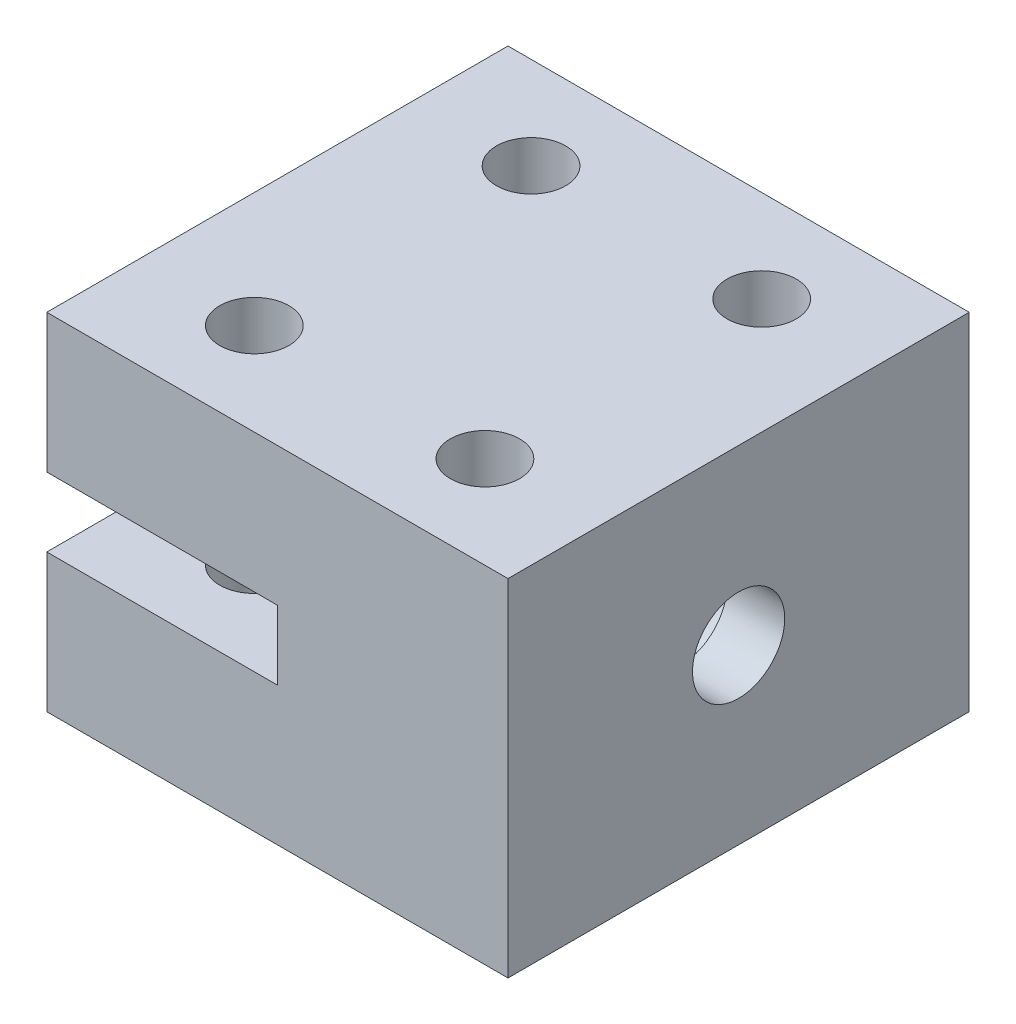
ISO-10303-21;
HEADER;
FILE_DESCRIPTION(('STEP AP214'),'2;1');
FILE_NAME('part.step','',(''),(''),'','','');
FILE_SCHEMA(('AUTOMOTIVE_DESIGN { 1 0 10303 214 1 1 1 1 }'));
ENDSEC;
DATA;
#1=APPLICATION_CONTEXT('core data for automotive mechanical design processes');
#2=APPLICATION_PROTOCOL_DEFINITION('international standard','automotive_design',2000,#1);
#3=PRODUCT_CONTEXT('',#1,'mechanical');
#4=PRODUCT('Part','Part','',(#3));
#5=PRODUCT_RELATED_PRODUCT_CATEGORY('part','',(#4));
#6=PRODUCT_DEFINITION_FORMATION('','',#4);
#7=PRODUCT_DEFINITION_CONTEXT('part definition',#1,'design');
#8=PRODUCT_DEFINITION('design','',#6,#7);
#9=PRODUCT_DEFINITION_SHAPE('','',#8);
#10=(LENGTH_UNIT() NAMED_UNIT(*) SI_UNIT(.MILLI.,.METRE.));
#11=(NAMED_UNIT(*) PLANE_ANGLE_UNIT() SI_UNIT($,.RADIAN.));
#12=(NAMED_UNIT(*) SI_UNIT($,.STERADIAN.) SOLID_ANGLE_UNIT());
#13=UNCERTAINTY_MEASURE_WITH_UNIT(LENGTH_MEASURE(1.E-05),#10,'distance_accuracy_value','');
#14=(GEOMETRIC_REPRESENTATION_CONTEXT(3) GLOBAL_UNCERTAINTY_ASSIGNED_CONTEXT((#13)) GLOBAL_UNIT_ASSIGNED_CONTEXT((#10,
#11,#12)) REPRESENTATION_CONTEXT('',''));
#15=CARTESIAN_POINT('',(0.,0.,0.));
#16=DIRECTION('',(0.,0.,1.));
#17=DIRECTION('',(1.,0.,0.));
#18=AXIS2_PLACEMENT_3D('',#15,#16,#17);
#19=CARTESIAN_POINT('',(9.99999999999999,7.5,-10.));
#20=DIRECTION('',(-1.,0.,0.));
#21=DIRECTION('',(0.,0.,1.));
#22=AXIS2_PLACEMENT_3D('',#19,#20,#21);
#23=PLANE('',#22);
#24=CARTESIAN_POINT('',(9.99999999999999,0.,0.));
#25=DIRECTION('',(1.,0.,0.));
#26=DIRECTION('',(0.,0.,-1.));
#27=AXIS2_PLACEMENT_3D('',#24,#25,#26);
#28=CIRCLE('',#27,2.);
#29=CARTESIAN_POINT('',(9.99999999999999,0.,-2.));
#30=VERTEX_POINT('',#29);
#31=EDGE_CURVE('E194',#30,#30,#28,.T.);
#32=ORIENTED_EDGE('',*,*,#31,.F.);
#33=EDGE_LOOP('',(#32));
#34=FACE_BOUND('',#33,.T.);
#35=DIRECTION('',(0.,-1.,0.));
#36=VECTOR('',#35,1.);
#37=CARTESIAN_POINT('',(9.99999999999999,7.5,-10.));
#38=LINE('',#37,#36);
#39=CARTESIAN_POINT('',(9.99999999999999,7.5,-10.));
#40=VERTEX_POINT('',#39);
#41=CARTESIAN_POINT('',(9.99999999999999,-7.5,-10.));
#42=VERTEX_POINT('',#41);
#43=EDGE_CURVE('E76',#40,#42,#38,.T.);
#44=ORIENTED_EDGE('',*,*,#43,.F.);
#45=DIRECTION('',(0.,0.,-1.));
#46=VECTOR('',#45,1.);
#47=CARTESIAN_POINT('',(9.99999999999999,7.5,-10.));
#48=LINE('',#47,#46);
#49=CARTESIAN_POINT('',(9.99999999999999,7.5,10.));
#50=VERTEX_POINT('',#49);
#51=EDGE_CURVE('E138',#50,#40,#48,.T.);
#52=ORIENTED_EDGE('',*,*,#51,.F.);
#53=DIRECTION('',(0.,-1.,0.));
#54=VECTOR('',#53,1.);
#55=CARTESIAN_POINT('',(9.99999999999999,7.5,10.));
#56=LINE('',#55,#54);
#57=CARTESIAN_POINT('',(9.99999999999999,-7.5,10.));
#58=VERTEX_POINT('',#57);
#59=EDGE_CURVE('E37',#50,#58,#56,.T.);
#60=ORIENTED_EDGE('',*,*,#59,.T.);
#61=DIRECTION('',(0.,0.,-1.));
#62=VECTOR('',#61,1.);
#63=CARTESIAN_POINT('',(9.99999999999999,-7.5,-10.));
#64=LINE('',#63,#62);
#65=EDGE_CURVE('E90',#58,#42,#64,.T.);
#66=ORIENTED_EDGE('',*,*,#65,.T.);
#67=EDGE_LOOP('',(#44,#52,#60,#66));
#68=FACE_BOUND('',#67,.T.);
#69=ADVANCED_FACE('F34',(#34,#68),#23,.F.);
#70=CARTESIAN_POINT('',(-10.,7.5,-10.));
#71=DIRECTION('',(0.,0.,1.));
#72=DIRECTION('',(1.,0.,0.));
#73=AXIS2_PLACEMENT_3D('',#70,#71,#72);
#74=PLANE('',#73);
#75=DIRECTION('',(-1.,0.,0.));
#76=VECTOR('',#75,1.);
#77=CARTESIAN_POINT('',(-10.,-1.5,-10.));
#78=LINE('',#77,#76);
#79=CARTESIAN_POINT('',(0.,-1.5,-10.));
#80=VERTEX_POINT('',#79);
#81=CARTESIAN_POINT('',(-10.,-1.5,-10.));
#82=VERTEX_POINT('',#81);
#83=EDGE_CURVE('E107',#80,#82,#78,.T.);
#84=ORIENTED_EDGE('',*,*,#83,.F.);
#85=DIRECTION('',(0.,-1.,0.));
#86=VECTOR('',#85,1.);
#87=CARTESIAN_POINT('',(0.,1.5,-10.));
#88=LINE('',#87,#86);
#89=CARTESIAN_POINT('',(0.,1.5,-10.));
#90=VERTEX_POINT('',#89);
#91=EDGE_CURVE('E118',#90,#80,#88,.T.);
#92=ORIENTED_EDGE('',*,*,#91,.F.);
#93=DIRECTION('',(-1.,0.,0.));
#94=VECTOR('',#93,1.);
#95=CARTESIAN_POINT('',(-10.,1.5,-10.));
#96=LINE('',#95,#94);
#97=CARTESIAN_POINT('',(-10.,1.5,-10.));
#98=VERTEX_POINT('',#97);
#99=EDGE_CURVE('E146',#90,#98,#96,.T.);
#100=ORIENTED_EDGE('',*,*,#99,.T.);
#101=DIRECTION('',(0.,-1.,0.));
#102=VECTOR('',#101,1.);
#103=CARTESIAN_POINT('',(-10.,7.5,-10.));
#104=LINE('',#103,#102);
#105=CARTESIAN_POINT('',(-10.,7.5,-10.));
#106=VERTEX_POINT('',#105);
#107=EDGE_CURVE('E123',#106,#98,#104,.T.);
#108=ORIENTED_EDGE('',*,*,#107,.F.);
#109=DIRECTION('',(-1.,0.,0.));
#110=VECTOR('',#109,1.);
#111=CARTESIAN_POINT('',(-10.,7.5,-10.));
#112=LINE('',#111,#110);
#113=EDGE_CURVE('E85',#40,#106,#112,.T.);
#114=ORIENTED_EDGE('',*,*,#113,.F.);
#115=ORIENTED_EDGE('',*,*,#43,.T.);
#116=DIRECTION('',(-1.,0.,0.));
#117=VECTOR('',#116,1.);
#118=CARTESIAN_POINT('',(-10.,-7.5,-10.));
#119=LINE('',#118,#117);
#120=CARTESIAN_POINT('',(-10.,-7.5,-10.));
#121=VERTEX_POINT('',#120);
#122=EDGE_CURVE('E80',#42,#121,#119,.T.);
#123=ORIENTED_EDGE('',*,*,#122,.T.);
#124=DIRECTION('',(0.,-1.,0.));
#125=VECTOR('',#124,1.);
#126=CARTESIAN_POINT('',(-10.,7.5,-10.));
#127=LINE('',#126,#125);
#128=EDGE_CURVE('E98',#82,#121,#127,.T.);
#129=ORIENTED_EDGE('',*,*,#128,.F.);
#130=EDGE_LOOP('',(#84,#92,#100,#108,#114,#115,#123,#129));
#131=FACE_BOUND('',#130,.T.);
#132=ADVANCED_FACE('F78',(#131),#74,.F.);
#133=CARTESIAN_POINT('',(-10.,7.5,-10.));
#134=DIRECTION('',(1.,0.,0.));
#135=DIRECTION('',(0.,0.,-1.));
#136=AXIS2_PLACEMENT_3D('',#133,#134,#135);
#137=PLANE('',#136);
#138=DIRECTION('',(0.,0.,1.));
#139=VECTOR('',#138,1.);
#140=CARTESIAN_POINT('',(-10.,-1.5,-10.));
#141=LINE('',#140,#139);
#142=CARTESIAN_POINT('',(-10.,-1.5,10.));
#143=VERTEX_POINT('',#142);
#144=EDGE_CURVE('E42',#82,#143,#141,.T.);
#145=ORIENTED_EDGE('',*,*,#144,.F.);
#146=ORIENTED_EDGE('',*,*,#128,.T.);
#147=DIRECTION('',(0.,0.,1.));
#148=VECTOR('',#147,1.);
#149=CARTESIAN_POINT('',(-10.,-7.5,-10.));
#150=LINE('',#149,#148);
#151=CARTESIAN_POINT('',(-10.,-7.5,10.));
#152=VERTEX_POINT('',#151);
#153=EDGE_CURVE('E97',#121,#152,#150,.T.);
#154=ORIENTED_EDGE('',*,*,#153,.T.);
#155=DIRECTION('',(0.,-1.,0.));
#156=VECTOR('',#155,1.);
#157=CARTESIAN_POINT('',(-10.,7.5,10.));
#158=LINE('',#157,#156);
#159=EDGE_CURVE('E110',#143,#152,#158,.T.);
#160=ORIENTED_EDGE('',*,*,#159,.F.);
#161=EDGE_LOOP('',(#145,#146,#154,#160));
#162=FACE_BOUND('',#161,.T.);
#163=ADVANCED_FACE('F205',(#162),#137,.F.);
#164=CARTESIAN_POINT('',(-10.,7.5,10.));
#165=DIRECTION('',(0.,0.,-1.));
#166=DIRECTION('',(-1.,0.,0.));
#167=AXIS2_PLACEMENT_3D('',#164,#165,#166);
#168=PLANE('',#167);
#169=DIRECTION('',(1.,0.,0.));
#170=VECTOR('',#169,1.);
#171=CARTESIAN_POINT('',(-10.,-1.5,10.));
#172=LINE('',#171,#170);
#173=CARTESIAN_POINT('',(0.,-1.5,10.));
#174=VERTEX_POINT('',#173);
#175=EDGE_CURVE('E11',#143,#174,#172,.T.);
#176=ORIENTED_EDGE('',*,*,#175,.F.);
#177=ORIENTED_EDGE('',*,*,#159,.T.);
#178=DIRECTION('',(1.,0.,0.));
#179=VECTOR('',#178,1.);
#180=CARTESIAN_POINT('',(-10.,-7.5,10.));
#181=LINE('',#180,#179);
#182=EDGE_CURVE('E108',#152,#58,#181,.T.);
#183=ORIENTED_EDGE('',*,*,#182,.T.);
#184=ORIENTED_EDGE('',*,*,#59,.F.);
#185=DIRECTION('',(1.,0.,0.));
#186=VECTOR('',#185,1.);
#187=CARTESIAN_POINT('',(-10.,7.5,10.));
#188=LINE('',#187,#186);
#189=CARTESIAN_POINT('',(-10.,7.5,10.));
#190=VERTEX_POINT('',#189);
#191=EDGE_CURVE('E131',#190,#50,#188,.T.);
#192=ORIENTED_EDGE('',*,*,#191,.F.);
#193=DIRECTION('',(0.,-1.,0.));
#194=VECTOR('',#193,1.);
#195=CARTESIAN_POINT('',(-10.,7.5,10.));
#196=LINE('',#195,#194);
#197=CARTESIAN_POINT('',(-10.,1.5,10.));
#198=VERTEX_POINT('',#197);
#199=EDGE_CURVE('E128',#190,#198,#196,.T.);
#200=ORIENTED_EDGE('',*,*,#199,.T.);
#201=DIRECTION('',(1.,0.,0.));
#202=VECTOR('',#201,1.);
#203=CARTESIAN_POINT('',(-10.,1.5,10.));
#204=LINE('',#203,#202);
#205=CARTESIAN_POINT('',(0.,1.5,10.));
#206=VERTEX_POINT('',#205);
#207=EDGE_CURVE('E140',#198,#206,#204,.T.);
#208=ORIENTED_EDGE('',*,*,#207,.T.);
#209=DIRECTION('',(0.,-1.,0.));
#210=VECTOR('',#209,1.);
#211=CARTESIAN_POINT('',(0.,1.5,10.));
#212=LINE('',#211,#210);
#213=EDGE_CURVE('E103',#206,#174,#212,.T.);
#214=ORIENTED_EDGE('',*,*,#213,.T.);
#215=EDGE_LOOP('',(#176,#177,#183,#184,#192,#200,#208,#214));
#216=FACE_BOUND('',#215,.T.);
#217=ADVANCED_FACE('F209',(#216),#168,.F.);
#218=CARTESIAN_POINT('',(0.,-7.5,0.));
#219=DIRECTION('',(0.,1.,0.));
#220=DIRECTION('',(0.,0.,1.));
#221=AXIS2_PLACEMENT_3D('',#218,#219,#220);
#222=PLANE('',#221);
#223=CARTESIAN_POINT('',(-5.,-7.5,6.));
#224=DIRECTION('',(0.,1.,0.));
#225=DIRECTION('',(0.,0.,1.));
#226=AXIS2_PLACEMENT_3D('',#223,#224,#225);
#227=CIRCLE('',#226,1.5);
#228=CARTESIAN_POINT('',(-5.,-7.5,7.5));
#229=VERTEX_POINT('',#228);
#230=EDGE_CURVE('E168',#229,#229,#227,.T.);
#231=ORIENTED_EDGE('',*,*,#230,.T.);
#232=EDGE_LOOP('',(#231));
#233=FACE_BOUND('',#232,.T.);
#234=CARTESIAN_POINT('',(5.,-7.5,6.));
#235=DIRECTION('',(0.,1.,0.));
#236=DIRECTION('',(0.,0.,1.));
#237=AXIS2_PLACEMENT_3D('',#234,#235,#236);
#238=CIRCLE('',#237,1.5);
#239=CARTESIAN_POINT('',(5.,-7.5,7.5));
#240=VERTEX_POINT('',#239);
#241=EDGE_CURVE('E176',#240,#240,#238,.T.);
#242=ORIENTED_EDGE('',*,*,#241,.T.);
#243=EDGE_LOOP('',(#242));
#244=FACE_BOUND('',#243,.T.);
#245=CARTESIAN_POINT('',(5.,-7.5,-6.));
#246=DIRECTION('',(0.,1.,0.));
#247=DIRECTION('',(0.,0.,1.));
#248=AXIS2_PLACEMENT_3D('',#245,#246,#247);
#249=CIRCLE('',#248,1.5);
#250=CARTESIAN_POINT('',(5.,-7.5,-4.5));
#251=VERTEX_POINT('',#250);
#252=EDGE_CURVE('E167',#251,#251,#249,.T.);
#253=ORIENTED_EDGE('',*,*,#252,.T.);
#254=EDGE_LOOP('',(#253));
#255=FACE_BOUND('',#254,.T.);
#256=CARTESIAN_POINT('',(-5.,-7.5,-6.));
#257=DIRECTION('',(0.,1.,0.));
#258=DIRECTION('',(0.,0.,1.));
#259=AXIS2_PLACEMENT_3D('',#256,#257,#258);
#260=CIRCLE('',#259,1.5);
#261=CARTESIAN_POINT('',(-5.,-7.5,-4.5));
#262=VERTEX_POINT('',#261);
#263=EDGE_CURVE('E161',#262,#262,#260,.T.);
#264=ORIENTED_EDGE('',*,*,#263,.T.);
#265=EDGE_LOOP('',(#264));
#266=FACE_BOUND('',#265,.T.);
#267=ORIENTED_EDGE('',*,*,#65,.F.);
#268=ORIENTED_EDGE('',*,*,#182,.F.);
#269=ORIENTED_EDGE('',*,*,#153,.F.);
#270=ORIENTED_EDGE('',*,*,#122,.F.);
#271=EDGE_LOOP('',(#267,#268,#269,#270));
#272=FACE_BOUND('',#271,.T.);
#273=ADVANCED_FACE('F94',(#233,#244,#255,#266,#272),#222,.F.);
#274=CARTESIAN_POINT('',(0.,-1.5,0.));
#275=DIRECTION('',(0.,1.,0.));
#276=DIRECTION('',(0.,0.,1.));
#277=AXIS2_PLACEMENT_3D('',#274,#275,#276);
#278=PLANE('',#277);
#279=CARTESIAN_POINT('',(-5.,-1.5,6.));
#280=DIRECTION('',(0.,1.,0.));
#281=DIRECTION('',(0.,0.,1.));
#282=AXIS2_PLACEMENT_3D('',#279,#280,#281);
#283=CIRCLE('',#282,1.5);
#284=CARTESIAN_POINT('',(-5.,-1.5,7.5));
#285=VERTEX_POINT('',#284);
#286=EDGE_CURVE('E149',#285,#285,#283,.T.);
#287=ORIENTED_EDGE('',*,*,#286,.F.);
#288=EDGE_LOOP('',(#287));
#289=FACE_BOUND('',#288,.T.);
#290=CARTESIAN_POINT('',(-5.,-1.5,-6.));
#291=DIRECTION('',(0.,1.,0.));
#292=DIRECTION('',(0.,0.,1.));
#293=AXIS2_PLACEMENT_3D('',#290,#291,#292);
#294=CIRCLE('',#293,1.5);
#295=CARTESIAN_POINT('',(-5.,-1.5,-4.5));
#296=VERTEX_POINT('',#295);
#297=EDGE_CURVE('E155',#296,#296,#294,.T.);
#298=ORIENTED_EDGE('',*,*,#297,.F.);
#299=EDGE_LOOP('',(#298));
#300=FACE_BOUND('',#299,.T.);
#301=DIRECTION('',(0.,0.,1.));
#302=VECTOR('',#301,1.);
#303=CARTESIAN_POINT('',(0.,-1.5,-10.));
#304=LINE('',#303,#302);
#305=EDGE_CURVE('E49',#80,#174,#304,.T.);
#306=ORIENTED_EDGE('',*,*,#305,.F.);
#307=ORIENTED_EDGE('',*,*,#83,.T.);
#308=ORIENTED_EDGE('',*,*,#144,.T.);
#309=ORIENTED_EDGE('',*,*,#175,.T.);
#310=EDGE_LOOP('',(#306,#307,#308,#309));
#311=FACE_BOUND('',#310,.T.);
#312=ADVANCED_FACE('F214',(#289,#300,#311),#278,.T.);
#313=CARTESIAN_POINT('',(0.,1.5,-10.));
#314=DIRECTION('',(1.,0.,0.));
#315=DIRECTION('',(0.,0.,-1.));
#316=AXIS2_PLACEMENT_3D('',#313,#314,#315);
#317=PLANE('',#316);
#318=ORIENTED_EDGE('',*,*,#305,.T.);
#319=ORIENTED_EDGE('',*,*,#213,.F.);
#320=DIRECTION('',(0.,0.,1.));
#321=VECTOR('',#320,1.);
#322=CARTESIAN_POINT('',(0.,1.5,-10.));
#323=LINE('',#322,#321);
#324=EDGE_CURVE('E121',#90,#206,#323,.T.);
#325=ORIENTED_EDGE('',*,*,#324,.F.);
#326=ORIENTED_EDGE('',*,*,#91,.T.);
#327=EDGE_LOOP('',(#318,#319,#325,#326));
#328=FACE_BOUND('',#327,.T.);
#329=ADVANCED_FACE('F217',(#328),#317,.F.);
#330=CARTESIAN_POINT('',(0.,1.5,0.));
#331=DIRECTION('',(0.,1.,0.));
#332=DIRECTION('',(0.,0.,1.));
#333=AXIS2_PLACEMENT_3D('',#330,#331,#332);
#334=PLANE('',#333);
#335=CARTESIAN_POINT('',(-5.,1.5,6.));
#336=DIRECTION('',(0.,1.,0.));
#337=DIRECTION('',(0.,0.,1.));
#338=AXIS2_PLACEMENT_3D('',#335,#336,#337);
#339=CIRCLE('',#338,1.5);
#340=CARTESIAN_POINT('',(-5.,1.5,7.5));
#341=VERTEX_POINT('',#340);
#342=EDGE_CURVE('E152',#341,#341,#339,.T.);
#343=ORIENTED_EDGE('',*,*,#342,.T.);
#344=EDGE_LOOP('',(#343));
#345=FACE_BOUND('',#344,.T.);
#346=CARTESIAN_POINT('',(-5.,1.5,-6.));
#347=DIRECTION('',(0.,1.,0.));
#348=DIRECTION('',(0.,0.,1.));
#349=AXIS2_PLACEMENT_3D('',#346,#347,#348);
#350=CIRCLE('',#349,1.5);
#351=CARTESIAN_POINT('',(-5.,1.5,-4.5));
#352=VERTEX_POINT('',#351);
#353=EDGE_CURVE('E158',#352,#352,#350,.T.);
#354=ORIENTED_EDGE('',*,*,#353,.T.);
#355=EDGE_LOOP('',(#354));
#356=FACE_BOUND('',#355,.T.);
#357=ORIENTED_EDGE('',*,*,#99,.F.);
#358=ORIENTED_EDGE('',*,*,#324,.T.);
#359=ORIENTED_EDGE('',*,*,#207,.F.);
#360=DIRECTION('',(0.,0.,1.));
#361=VECTOR('',#360,1.);
#362=CARTESIAN_POINT('',(-10.,1.5,-10.));
#363=LINE('',#362,#361);
#364=EDGE_CURVE('E143',#98,#198,#363,.T.);
#365=ORIENTED_EDGE('',*,*,#364,.F.);
#366=EDGE_LOOP('',(#357,#358,#359,#365));
#367=FACE_BOUND('',#366,.T.);
#368=ADVANCED_FACE('F224',(#345,#356,#367),#334,.F.);
#369=CARTESIAN_POINT('',(0.,7.5,0.));
#370=DIRECTION('',(0.,1.,0.));
#371=DIRECTION('',(0.,0.,1.));
#372=AXIS2_PLACEMENT_3D('',#369,#370,#371);
#373=PLANE('',#372);
#374=CARTESIAN_POINT('',(-5.,7.5,6.));
#375=DIRECTION('',(0.,1.,0.));
#376=DIRECTION('',(0.,0.,1.));
#377=AXIS2_PLACEMENT_3D('',#374,#375,#376);
#378=CIRCLE('',#377,1.5);
#379=CARTESIAN_POINT('',(-5.,7.5,7.5));
#380=VERTEX_POINT('',#379);
#381=EDGE_CURVE('E172',#380,#380,#378,.T.);
#382=ORIENTED_EDGE('',*,*,#381,.F.);
#383=EDGE_LOOP('',(#382));
#384=FACE_BOUND('',#383,.T.);
#385=CARTESIAN_POINT('',(5.,7.5,6.));
#386=DIRECTION('',(0.,1.,0.));
#387=DIRECTION('',(0.,0.,1.));
#388=AXIS2_PLACEMENT_3D('',#385,#386,#387);
#389=CIRCLE('',#388,1.5);
#390=CARTESIAN_POINT('',(5.,7.5,7.5));
#391=VERTEX_POINT('',#390);
#392=EDGE_CURVE('E171',#391,#391,#389,.T.);
#393=ORIENTED_EDGE('',*,*,#392,.F.);
#394=EDGE_LOOP('',(#393));
#395=FACE_BOUND('',#394,.T.);
#396=CARTESIAN_POINT('',(5.,7.5,-6.));
#397=DIRECTION('',(0.,1.,0.));
#398=DIRECTION('',(0.,0.,1.));
#399=AXIS2_PLACEMENT_3D('',#396,#397,#398);
#400=CIRCLE('',#399,1.5);
#401=CARTESIAN_POINT('',(5.,7.5,-4.5));
#402=VERTEX_POINT('',#401);
#403=EDGE_CURVE('E179',#402,#402,#400,.T.);
#404=ORIENTED_EDGE('',*,*,#403,.F.);
#405=EDGE_LOOP('',(#404));
#406=FACE_BOUND('',#405,.T.);
#407=CARTESIAN_POINT('',(-5.,7.5,-6.));
#408=DIRECTION('',(0.,1.,0.));
#409=DIRECTION('',(0.,0.,1.));
#410=AXIS2_PLACEMENT_3D('',#407,#408,#409);
#411=CIRCLE('',#410,1.5);
#412=CARTESIAN_POINT('',(-5.,7.5,-4.5));
#413=VERTEX_POINT('',#412);
#414=EDGE_CURVE('E164',#413,#413,#411,.T.);
#415=ORIENTED_EDGE('',*,*,#414,.F.);
#416=EDGE_LOOP('',(#415));
#417=FACE_BOUND('',#416,.T.);
#418=ORIENTED_EDGE('',*,*,#51,.T.);
#419=ORIENTED_EDGE('',*,*,#113,.T.);
#420=DIRECTION('',(0.,0.,1.));
#421=VECTOR('',#420,1.);
#422=CARTESIAN_POINT('',(-10.,7.5,-10.));
#423=LINE('',#422,#421);
#424=EDGE_CURVE('E134',#106,#190,#423,.T.);
#425=ORIENTED_EDGE('',*,*,#424,.T.);
#426=ORIENTED_EDGE('',*,*,#191,.T.);
#427=EDGE_LOOP('',(#418,#419,#425,#426));
#428=FACE_BOUND('',#427,.T.);
#429=ADVANCED_FACE('F230',(#384,#395,#406,#417,#428),#373,.T.);
#430=CARTESIAN_POINT('',(-10.,7.5,-10.));
#431=DIRECTION('',(1.,0.,0.));
#432=DIRECTION('',(0.,0.,-1.));
#433=AXIS2_PLACEMENT_3D('',#430,#431,#432);
#434=PLANE('',#433);
#435=ORIENTED_EDGE('',*,*,#107,.T.);
#436=ORIENTED_EDGE('',*,*,#364,.T.);
#437=ORIENTED_EDGE('',*,*,#199,.F.);
#438=ORIENTED_EDGE('',*,*,#424,.F.);
#439=EDGE_LOOP('',(#435,#436,#437,#438));
#440=FACE_BOUND('',#439,.T.);
#441=ADVANCED_FACE('F226',(#440),#434,.F.);
#442=CARTESIAN_POINT('',(-5.,-7.5,-6.));
#443=DIRECTION('',(0.,1.,0.));
#444=DIRECTION('',(0.,0.,1.));
#445=AXIS2_PLACEMENT_3D('',#442,#443,#444);
#446=CYLINDRICAL_SURFACE('',#445,1.5);
#447=ORIENTED_EDGE('',*,*,#414,.T.);
#448=EDGE_LOOP('',(#447));
#449=FACE_BOUND('',#448,.T.);
#450=ORIENTED_EDGE('',*,*,#353,.F.);
#451=EDGE_LOOP('',(#450));
#452=FACE_BOUND('',#451,.T.);
#453=ADVANCED_FACE('F229',(#449,#452),#446,.F.);
#454=CARTESIAN_POINT('',(5.,-7.5,-6.));
#455=DIRECTION('',(0.,1.,0.));
#456=DIRECTION('',(0.,0.,1.));
#457=AXIS2_PLACEMENT_3D('',#454,#455,#456);
#458=CYLINDRICAL_SURFACE('',#457,1.5);
#459=ORIENTED_EDGE('',*,*,#252,.F.);
#460=EDGE_LOOP('',(#459));
#461=FACE_BOUND('',#460,.T.);
#462=ORIENTED_EDGE('',*,*,#403,.T.);
#463=EDGE_LOOP('',(#462));
#464=FACE_BOUND('',#463,.T.);
#465=ADVANCED_FACE('F250',(#461,#464),#458,.F.);
#466=CARTESIAN_POINT('',(5.,-7.5,6.));
#467=DIRECTION('',(0.,1.,0.));
#468=DIRECTION('',(0.,0.,1.));
#469=AXIS2_PLACEMENT_3D('',#466,#467,#468);
#470=CYLINDRICAL_SURFACE('',#469,1.5);
#471=ORIENTED_EDGE('',*,*,#241,.F.);
#472=EDGE_LOOP('',(#471));
#473=FACE_BOUND('',#472,.T.);
#474=ORIENTED_EDGE('',*,*,#392,.T.);
#475=EDGE_LOOP('',(#474));
#476=FACE_BOUND('',#475,.T.);
#477=ADVANCED_FACE('F247',(#473,#476),#470,.F.);
#478=CARTESIAN_POINT('',(-5.,-7.5,6.));
#479=DIRECTION('',(0.,1.,0.));
#480=DIRECTION('',(0.,0.,1.));
#481=AXIS2_PLACEMENT_3D('',#478,#479,#480);
#482=CYLINDRICAL_SURFACE('',#481,1.5);
#483=ORIENTED_EDGE('',*,*,#381,.T.);
#484=EDGE_LOOP('',(#483));
#485=FACE_BOUND('',#484,.T.);
#486=ORIENTED_EDGE('',*,*,#342,.F.);
#487=EDGE_LOOP('',(#486));
#488=FACE_BOUND('',#487,.T.);
#489=ADVANCED_FACE('F242',(#485,#488),#482,.F.);
#490=ORIENTED_EDGE('',*,*,#297,.T.);
#491=EDGE_LOOP('',(#490));
#492=FACE_BOUND('',#491,.T.);
#493=ORIENTED_EDGE('',*,*,#263,.F.);
#494=EDGE_LOOP('',(#493));
#495=FACE_BOUND('',#494,.T.);
#496=ADVANCED_FACE('F238',(#492,#495),#446,.F.);
#497=ORIENTED_EDGE('',*,*,#286,.T.);
#498=EDGE_LOOP('',(#497));
#499=FACE_BOUND('',#498,.T.);
#500=ORIENTED_EDGE('',*,*,#230,.F.);
#501=EDGE_LOOP('',(#500));
#502=FACE_BOUND('',#501,.T.);
#503=ADVANCED_FACE('F241',(#499,#502),#482,.F.);
#504=CARTESIAN_POINT('',(4.99999999999999,0.,0.));
#505=DIRECTION('',(1.,0.,0.));
#506=DIRECTION('',(0.,0.,-1.));
#507=AXIS2_PLACEMENT_3D('',#504,#505,#506);
#508=CYLINDRICAL_SURFACE('',#507,2.);
#509=ORIENTED_EDGE('',*,*,#31,.T.);
#510=EDGE_LOOP('',(#509));
#511=FACE_BOUND('',#510,.T.);
#512=CARTESIAN_POINT('',(7.49999999999999,0.,0.));
#513=DIRECTION('',(1.,0.,0.));
#514=DIRECTION('',(0.,0.,-1.));
#515=AXIS2_PLACEMENT_3D('',#512,#513,#514);
#516=CIRCLE('',#515,2.);
#517=CARTESIAN_POINT('',(7.49999999999999,0.,-2.));
#518=VERTEX_POINT('',#517);
#519=EDGE_CURVE('E189',#518,#518,#516,.T.);
#520=ORIENTED_EDGE('',*,*,#519,.F.);
#521=EDGE_LOOP('',(#520));
#522=FACE_BOUND('',#521,.T.);
#523=ADVANCED_FACE('F198',(#511,#522),#508,.F.);
#524=CARTESIAN_POINT('',(7.49999999999999,0.,0.));
#525=DIRECTION('',(-1.,0.,0.));
#526=DIRECTION('',(0.,0.,1.));
#527=AXIS2_PLACEMENT_3D('',#524,#525,#526);
#528=CYLINDRICAL_SURFACE('',#527,3.5);
#529=CARTESIAN_POINT('',(7.49999999999999,0.,0.));
#530=DIRECTION('',(1.,0.,0.));
#531=DIRECTION('',(0.,0.,-1.));
#532=AXIS2_PLACEMENT_3D('',#529,#530,#531);
#533=CIRCLE('',#532,3.5);
#534=CARTESIAN_POINT('',(7.49999999999999,0.,-3.5));
#535=VERTEX_POINT('',#534);
#536=EDGE_CURVE('E175',#535,#535,#533,.T.);
#537=ORIENTED_EDGE('',*,*,#536,.T.);
#538=EDGE_LOOP('',(#537));
#539=FACE_BOUND('',#538,.T.);
#540=CARTESIAN_POINT('',(4.99999999999999,0.,0.));
#541=DIRECTION('',(1.,0.,0.));
#542=DIRECTION('',(0.,0.,-1.));
#543=AXIS2_PLACEMENT_3D('',#540,#541,#542);
#544=CIRCLE('',#543,3.5);
#545=CARTESIAN_POINT('',(4.99999999999999,0.,-3.5));
#546=VERTEX_POINT('',#545);
#547=EDGE_CURVE('E186',#546,#546,#544,.T.);
#548=ORIENTED_EDGE('',*,*,#547,.F.);
#549=EDGE_LOOP('',(#548));
#550=FACE_BOUND('',#549,.T.);
#551=ADVANCED_FACE('F255',(#539,#550),#528,.F.);
#552=CARTESIAN_POINT('',(7.49999999999999,0.,0.));
#553=DIRECTION('',(1.,0.,0.));
#554=DIRECTION('',(0.,0.,-1.));
#555=AXIS2_PLACEMENT_3D('',#552,#553,#554);
#556=PLANE('',#555);
#557=ORIENTED_EDGE('',*,*,#519,.T.);
#558=EDGE_LOOP('',(#557));
#559=FACE_BOUND('',#558,.T.);
#560=ORIENTED_EDGE('',*,*,#536,.F.);
#561=EDGE_LOOP('',(#560));
#562=FACE_BOUND('',#561,.T.);
#563=ADVANCED_FACE('F258',(#559,#562),#556,.F.);
#564=CARTESIAN_POINT('',(4.99999999999999,0.,0.));
#565=DIRECTION('',(1.,0.,0.));
#566=DIRECTION('',(0.,0.,-1.));
#567=AXIS2_PLACEMENT_3D('',#564,#565,#566);
#568=PLANE('',#567);
#569=ORIENTED_EDGE('',*,*,#547,.T.);
#570=EDGE_LOOP('',(#569));
#571=FACE_BOUND('',#570,.T.);
#572=ADVANCED_FACE('F260',(#571),#568,.T.);
#573=CLOSED_SHELL('',(#69,#132,#163,#217,#273,#312,#329,#368,#429,#441,#453,#465,#477,#489,#496,
#503,#523,#551,#563,#572));
#574=MANIFOLD_SOLID_BREP('B2',#573);
#575=ADVANCED_BREP_SHAPE_REPRESENTATION('',(#18,#574),#14);
#576=SHAPE_DEFINITION_REPRESENTATION(#9,#575);
ENDSEC;
END-ISO-10303-21;
